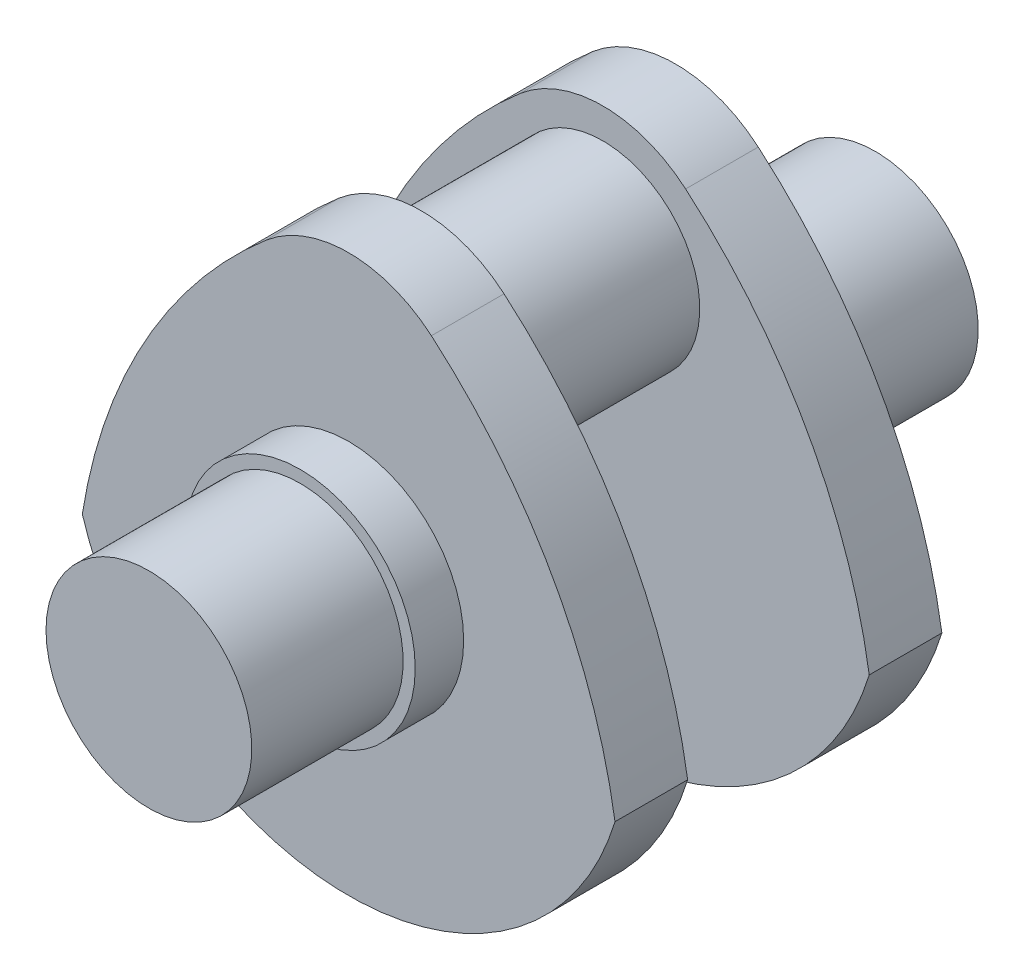
ISO-10303-21;
HEADER;
FILE_DESCRIPTION(('STEP AP214'),'2;1');
FILE_NAME('part.step','',(''),(''),'','','');
FILE_SCHEMA(('AUTOMOTIVE_DESIGN { 1 0 10303 214 1 1 1 1 }'));
ENDSEC;
DATA;
#1=APPLICATION_CONTEXT('core data for automotive mechanical design processes');
#2=APPLICATION_PROTOCOL_DEFINITION('international standard','automotive_design',2000,#1);
#3=PRODUCT_CONTEXT('',#1,'mechanical');
#4=PRODUCT('Part','Part','',(#3));
#5=PRODUCT_RELATED_PRODUCT_CATEGORY('part','',(#4));
#6=PRODUCT_DEFINITION_FORMATION('','',#4);
#7=PRODUCT_DEFINITION_CONTEXT('part definition',#1,'design');
#8=PRODUCT_DEFINITION('design','',#6,#7);
#9=PRODUCT_DEFINITION_SHAPE('','',#8);
#10=(LENGTH_UNIT() NAMED_UNIT(*) SI_UNIT(.MILLI.,.METRE.));
#11=(NAMED_UNIT(*) PLANE_ANGLE_UNIT() SI_UNIT($,.RADIAN.));
#12=(NAMED_UNIT(*) SI_UNIT($,.STERADIAN.) SOLID_ANGLE_UNIT());
#13=UNCERTAINTY_MEASURE_WITH_UNIT(LENGTH_MEASURE(1.E-05),#10,'distance_accuracy_value','');
#14=(GEOMETRIC_REPRESENTATION_CONTEXT(3) GLOBAL_UNCERTAINTY_ASSIGNED_CONTEXT((#13)) GLOBAL_UNIT_ASSIGNED_CONTEXT((#10,
#11,#12)) REPRESENTATION_CONTEXT('',''));
#15=CARTESIAN_POINT('',(0.,0.,0.));
#16=DIRECTION('',(0.,0.,1.));
#17=DIRECTION('',(1.,0.,0.));
#18=AXIS2_PLACEMENT_3D('',#15,#16,#17);
#19=CARTESIAN_POINT('',(0.,0.,635.));
#20=DIRECTION('',(0.,0.,-1.));
#21=DIRECTION('',(-1.,0.,0.));
#22=AXIS2_PLACEMENT_3D('',#19,#20,#21);
#23=CYLINDRICAL_SURFACE('',#22,431.8);
#24=CARTESIAN_POINT('',(0.,0.,635.));
#25=DIRECTION('',(0.,0.,1.));
#26=DIRECTION('',(1.,0.,0.));
#27=AXIS2_PLACEMENT_3D('',#24,#25,#26);
#28=CIRCLE('',#27,431.8);
#29=CARTESIAN_POINT('',(-431.8,0.,635.));
#30=VERTEX_POINT('',#29);
#31=EDGE_CURVE('E11',#30,#30,#28,.T.);
#32=CARTESIAN_POINT('',(0.,0.,0.));
#33=DIRECTION('',(0.,0.,1.));
#34=DIRECTION('',(1.,0.,0.));
#35=AXIS2_PLACEMENT_3D('',#32,#33,#34);
#36=CIRCLE('',#35,431.8);
#37=CARTESIAN_POINT('',(-431.8,0.,-1.11022302462516E-13));
#38=VERTEX_POINT('',#37);
#39=EDGE_CURVE('E39',#38,#38,#36,.T.);
#40=CARTESIAN_POINT('',(-431.8,0.,635.));
#41=CARTESIAN_POINT('',(-431.8,0.,628.385416666667));
#42=CARTESIAN_POINT('',(-431.8,0.,621.770833333333));
#43=CARTESIAN_POINT('',(-431.8,0.,608.541666666667));
#44=CARTESIAN_POINT('',(-431.8,0.,601.927083333333));
#45=CARTESIAN_POINT('',(-431.8,0.,588.697916666667));
#46=CARTESIAN_POINT('',(-431.8,0.,582.083333333333));
#47=CARTESIAN_POINT('',(-431.8,0.,568.854166666667));
#48=CARTESIAN_POINT('',(-431.8,0.,562.239583333333));
#49=CARTESIAN_POINT('',(-431.8,0.,549.010416666667));
#50=CARTESIAN_POINT('',(-431.8,0.,542.395833333333));
#51=CARTESIAN_POINT('',(-431.8,0.,529.166666666667));
#52=CARTESIAN_POINT('',(-431.8,0.,522.552083333333));
#53=CARTESIAN_POINT('',(-431.8,0.,509.322916666667));
#54=CARTESIAN_POINT('',(-431.8,0.,502.708333333333));
#55=CARTESIAN_POINT('',(-431.8,0.,489.479166666667));
#56=CARTESIAN_POINT('',(-431.8,0.,482.864583333333));
#57=CARTESIAN_POINT('',(-431.8,0.,469.635416666667));
#58=CARTESIAN_POINT('',(-431.8,0.,463.020833333333));
#59=CARTESIAN_POINT('',(-431.8,0.,449.791666666667));
#60=CARTESIAN_POINT('',(-431.8,0.,443.177083333333));
#61=CARTESIAN_POINT('',(-431.8,0.,429.947916666667));
#62=CARTESIAN_POINT('',(-431.8,0.,423.333333333333));
#63=CARTESIAN_POINT('',(-431.8,0.,410.104166666667));
#64=CARTESIAN_POINT('',(-431.8,0.,403.489583333333));
#65=CARTESIAN_POINT('',(-431.8,0.,390.260416666667));
#66=CARTESIAN_POINT('',(-431.8,0.,383.645833333333));
#67=CARTESIAN_POINT('',(-431.8,0.,370.416666666667));
#68=CARTESIAN_POINT('',(-431.8,0.,363.802083333333));
#69=CARTESIAN_POINT('',(-431.8,0.,350.572916666667));
#70=CARTESIAN_POINT('',(-431.8,0.,343.958333333333));
#71=CARTESIAN_POINT('',(-431.8,0.,330.729166666667));
#72=CARTESIAN_POINT('',(-431.8,0.,324.114583333333));
#73=CARTESIAN_POINT('',(-431.8,0.,310.885416666667));
#74=CARTESIAN_POINT('',(-431.8,0.,304.270833333333));
#75=CARTESIAN_POINT('',(-431.8,0.,291.041666666667));
#76=CARTESIAN_POINT('',(-431.8,0.,284.427083333333));
#77=CARTESIAN_POINT('',(-431.8,0.,271.197916666667));
#78=CARTESIAN_POINT('',(-431.8,0.,264.583333333333));
#79=CARTESIAN_POINT('',(-431.8,0.,251.354166666667));
#80=CARTESIAN_POINT('',(-431.8,0.,244.739583333333));
#81=CARTESIAN_POINT('',(-431.8,0.,231.510416666667));
#82=CARTESIAN_POINT('',(-431.8,0.,224.895833333333));
#83=CARTESIAN_POINT('',(-431.8,0.,211.666666666667));
#84=CARTESIAN_POINT('',(-431.8,0.,205.052083333333));
#85=CARTESIAN_POINT('',(-431.8,0.,191.822916666666));
#86=CARTESIAN_POINT('',(-431.8,0.,185.208333333333));
#87=CARTESIAN_POINT('',(-431.8,0.,171.979166666666));
#88=CARTESIAN_POINT('',(-431.8,0.,165.364583333333));
#89=CARTESIAN_POINT('',(-431.8,0.,152.135416666666));
#90=CARTESIAN_POINT('',(-431.8,0.,145.520833333333));
#91=CARTESIAN_POINT('',(-431.8,0.,132.291666666667));
#92=CARTESIAN_POINT('',(-431.8,0.,125.677083333333));
#93=CARTESIAN_POINT('',(-431.8,0.,112.447916666667));
#94=CARTESIAN_POINT('',(-431.8,0.,105.833333333333));
#95=CARTESIAN_POINT('',(-431.8,0.,92.6041666666666));
#96=CARTESIAN_POINT('',(-431.8,0.,85.9895833333332));
#97=CARTESIAN_POINT('',(-431.8,0.,72.7604166666665));
#98=CARTESIAN_POINT('',(-431.8,0.,66.1458333333332));
#99=CARTESIAN_POINT('',(-431.8,0.,52.9166666666666));
#100=CARTESIAN_POINT('',(-431.8,0.,46.3020833333332));
#101=CARTESIAN_POINT('',(-431.8,0.,33.0729166666666));
#102=CARTESIAN_POINT('',(-431.8,0.,26.4583333333333));
#103=CARTESIAN_POINT('',(-431.8,0.,13.2291666666666));
#104=CARTESIAN_POINT('',(-431.8,0.,6.61458333333324));
#105=CARTESIAN_POINT('',(-431.8,0.,-1.11022302462516E-13));
#106=B_SPLINE_CURVE_WITH_KNOTS('',3,(#40,#41,#42,#43,#44,#45,#46,#47,#48,#49,#50,#51,#52,#53,
#54,#55,#56,#57,#58,#59,#60,#61,#62,#63,#64,#65,#66,#67,#68,#69,#70,#71,#72,#73,#74,#75,#76,#77,
#78,#79,#80,#81,#82,#83,#84,#85,#86,#87,#88,#89,#90,#91,#92,#93,#94,#95,#96,#97,#98,#99,#100,
#101,#102,#103,#104,#105),.UNSPECIFIED.,.F.,.F.,(4,2,2,2,2,2,2,2,2,2,2,2,2,2,2,2,2,2,2,2,2,2,2,
2,2,2,2,2,2,2,2,2,4),(0.,19.84375,39.6875000000001,59.53125,79.3750000000001,99.2187500000001,
119.0625,138.90625,158.75,178.59375,198.4375,218.28125,238.125,257.96875,277.8125,297.65625,
317.5,337.34375,357.1875,377.03125,396.875,416.71875,436.5625,456.40625,476.25,496.09375,
515.9375,535.78125,555.625,575.46875,595.3125,615.15625,635.),.UNSPECIFIED.);
#107=EDGE_CURVE('BSEAM36',#30,#38,#106,.T.);
#108=ORIENTED_EDGE('',*,*,#31,.F.);
#109=ORIENTED_EDGE('',*,*,#39,.T.);
#110=ORIENTED_EDGE('',*,*,#107,.T.);
#111=ORIENTED_EDGE('',*,*,#107,.F.);
#112=EDGE_LOOP('',(#108,#110,#109,#111));
#113=FACE_BOUND('',#112,.T.);
#114=ADVANCED_FACE('F36',(#113),#23,.T.);
#115=CARTESIAN_POINT('',(0.,0.,635.));
#116=DIRECTION('',(0.,0.,1.));
#117=DIRECTION('',(1.,0.,0.));
#118=AXIS2_PLACEMENT_3D('',#115,#116,#117);
#119=PLANE('',#118);
#120=ORIENTED_EDGE('',*,*,#31,.T.);
#121=EDGE_LOOP('',(#120));
#122=FACE_BOUND('',#121,.T.);
#123=ADVANCED_FACE('F215',(#122),#119,.T.);
#124=CARTESIAN_POINT('',(0.,0.,-203.2));
#125=DIRECTION('',(0.,0.,1.));
#126=DIRECTION('',(1.,0.,0.));
#127=AXIS2_PLACEMENT_3D('',#124,#125,#126);
#128=CYLINDRICAL_SURFACE('',#127,482.6);
#129=CARTESIAN_POINT('',(0.,0.,-203.2));
#130=DIRECTION('',(0.,0.,1.));
#131=DIRECTION('',(1.,0.,0.));
#132=AXIS2_PLACEMENT_3D('',#129,#130,#131);
#133=CIRCLE('',#132,482.6);
#134=CARTESIAN_POINT('',(482.6,0.,-203.2));
#135=VERTEX_POINT('',#134);
#136=EDGE_CURVE('E192',#135,#135,#133,.T.);
#137=ORIENTED_EDGE('',*,*,#136,.T.);
#138=EDGE_LOOP('',(#137));
#139=FACE_BOUND('',#138,.T.);
#140=CARTESIAN_POINT('',(0.,0.,0.));
#141=DIRECTION('',(0.,0.,1.));
#142=DIRECTION('',(1.,0.,0.));
#143=AXIS2_PLACEMENT_3D('',#140,#141,#142);
#144=CIRCLE('',#143,482.6);
#145=CARTESIAN_POINT('',(482.6,0.,0.));
#146=VERTEX_POINT('',#145);
#147=EDGE_CURVE('E195',#146,#146,#144,.T.);
#148=ORIENTED_EDGE('',*,*,#147,.F.);
#149=EDGE_LOOP('',(#148));
#150=FACE_BOUND('',#149,.T.);
#151=ADVANCED_FACE('F206',(#139,#150),#128,.T.);
#152=CARTESIAN_POINT('',(0.,0.,0.));
#153=DIRECTION('',(0.,0.,1.));
#154=DIRECTION('',(1.,0.,0.));
#155=AXIS2_PLACEMENT_3D('',#152,#153,#154);
#156=PLANE('',#155);
#157=ORIENTED_EDGE('',*,*,#39,.F.);
#158=EDGE_LOOP('',(#157));
#159=FACE_BOUND('',#158,.T.);
#160=ORIENTED_EDGE('',*,*,#147,.T.);
#161=EDGE_LOOP('',(#160));
#162=FACE_BOUND('',#161,.T.);
#163=ADVANCED_FACE('F203',(#159,#162),#156,.T.);
#164=CARTESIAN_POINT('',(-1140.70013677076,-695.567532285063,-508.));
#165=DIRECTION('',(0.,0.,1.));
#166=DIRECTION('',(1.,0.,0.));
#167=AXIS2_PLACEMENT_3D('',#164,#165,#166);
#168=CYLINDRICAL_SURFACE('',#167,2286.);
#169=CARTESIAN_POINT('',(-1140.70013677076,-695.567532285063,-203.2));
#170=DIRECTION('',(0.,0.,-1.));
#171=DIRECTION('',(-1.,0.,0.));
#172=AXIS2_PLACEMENT_3D('',#169,#170,#171);
#173=CIRCLE('',#172,2286.);
#174=CARTESIAN_POINT('',(347.169606843276,1039.95533591285,-203.2));
#175=VERTEX_POINT('',#174);
#176=CARTESIAN_POINT('',(1117.6,-340.776759770967,-203.2));
#177=VERTEX_POINT('',#176);
#178=EDGE_CURVE('E171',#175,#177,#173,.T.);
#179=ORIENTED_EDGE('',*,*,#178,.T.);
#180=DIRECTION('',(0.,0.,1.));
#181=VECTOR('',#180,1.);
#182=CARTESIAN_POINT('',(1117.6,-340.776759770967,-508.));
#183=LINE('',#182,#181);
#184=CARTESIAN_POINT('',(1117.6,-340.776759770967,-508.));
#185=VERTEX_POINT('',#184);
#186=EDGE_CURVE('E190',#185,#177,#183,.T.);
#187=ORIENTED_EDGE('',*,*,#186,.F.);
#188=CARTESIAN_POINT('',(-1140.70013677076,-695.567532285063,-508.));
#189=DIRECTION('',(0.,0.,-1.));
#190=DIRECTION('',(-1.,0.,0.));
#191=AXIS2_PLACEMENT_3D('',#188,#189,#190);
#192=CIRCLE('',#191,2286.);
#193=CARTESIAN_POINT('',(347.169606843276,1039.95533591285,-508.));
#194=VERTEX_POINT('',#193);
#195=EDGE_CURVE('E172',#194,#185,#192,.T.);
#196=ORIENTED_EDGE('',*,*,#195,.F.);
#197=DIRECTION('',(0.,0.,1.));
#198=VECTOR('',#197,1.);
#199=CARTESIAN_POINT('',(347.169606843276,1039.95533591285,-508.));
#200=LINE('',#199,#198);
#201=EDGE_CURVE('E178',#194,#175,#200,.T.);
#202=ORIENTED_EDGE('',*,*,#201,.T.);
#203=EDGE_LOOP('',(#179,#187,#196,#202));
#204=FACE_BOUND('',#203,.T.);
#205=ADVANCED_FACE('F205',(#204),#168,.T.);
#206=CARTESIAN_POINT('',(0.,0.,-508.));
#207=DIRECTION('',(0.,0.,1.));
#208=DIRECTION('',(1.,0.,0.));
#209=AXIS2_PLACEMENT_3D('',#206,#207,#208);
#210=CYLINDRICAL_SURFACE('',#209,1168.4);
#211=CARTESIAN_POINT('',(0.,0.,-203.2));
#212=DIRECTION('',(0.,0.,-1.));
#213=DIRECTION('',(-1.,0.,0.));
#214=AXIS2_PLACEMENT_3D('',#211,#212,#213);
#215=CIRCLE('',#214,1168.4);
#216=CARTESIAN_POINT('',(-1117.6,-340.776759770968,-203.2));
#217=VERTEX_POINT('',#216);
#218=EDGE_CURVE('E181',#177,#217,#215,.T.);
#219=ORIENTED_EDGE('',*,*,#218,.T.);
#220=DIRECTION('',(0.,0.,1.));
#221=VECTOR('',#220,1.);
#222=CARTESIAN_POINT('',(-1117.6,-340.776759770968,-508.));
#223=LINE('',#222,#221);
#224=CARTESIAN_POINT('',(-1117.6,-340.776759770968,-508.));
#225=VERTEX_POINT('',#224);
#226=EDGE_CURVE('E188',#225,#217,#223,.T.);
#227=ORIENTED_EDGE('',*,*,#226,.F.);
#228=CARTESIAN_POINT('',(0.,0.,-508.));
#229=DIRECTION('',(0.,0.,-1.));
#230=DIRECTION('',(-1.,0.,0.));
#231=AXIS2_PLACEMENT_3D('',#228,#229,#230);
#232=CIRCLE('',#231,1168.4);
#233=EDGE_CURVE('E84',#185,#225,#232,.T.);
#234=ORIENTED_EDGE('',*,*,#233,.F.);
#235=ORIENTED_EDGE('',*,*,#186,.T.);
#236=EDGE_LOOP('',(#219,#227,#234,#235));
#237=FACE_BOUND('',#236,.T.);
#238=ADVANCED_FACE('F212',(#237),#210,.T.);
#239=CARTESIAN_POINT('',(1140.70013677076,-695.567532285061,-508.));
#240=DIRECTION('',(0.,0.,1.));
#241=DIRECTION('',(1.,0.,0.));
#242=AXIS2_PLACEMENT_3D('',#239,#240,#241);
#243=CYLINDRICAL_SURFACE('',#242,2286.);
#244=CARTESIAN_POINT('',(1140.70013677076,-695.567532285061,-203.2));
#245=DIRECTION('',(0.,0.,-1.));
#246=DIRECTION('',(1.,0.,0.));
#247=AXIS2_PLACEMENT_3D('',#244,#245,#246);
#248=CIRCLE('',#247,2286.);
#249=CARTESIAN_POINT('',(-347.169606843277,1039.95533591285,-203.2));
#250=VERTEX_POINT('',#249);
#251=EDGE_CURVE('E70',#217,#250,#248,.T.);
#252=ORIENTED_EDGE('',*,*,#251,.T.);
#253=DIRECTION('',(0.,0.,1.));
#254=VECTOR('',#253,1.);
#255=CARTESIAN_POINT('',(-347.169606843277,1039.95533591285,-508.));
#256=LINE('',#255,#254);
#257=CARTESIAN_POINT('',(-347.169606843277,1039.95533591285,-508.));
#258=VERTEX_POINT('',#257);
#259=EDGE_CURVE('E186',#258,#250,#256,.T.);
#260=ORIENTED_EDGE('',*,*,#259,.F.);
#261=CARTESIAN_POINT('',(1140.70013677076,-695.567532285061,-508.));
#262=DIRECTION('',(0.,0.,-1.));
#263=DIRECTION('',(1.,0.,0.));
#264=AXIS2_PLACEMENT_3D('',#261,#262,#263);
#265=CIRCLE('',#264,2286.);
#266=EDGE_CURVE('E175',#225,#258,#265,.T.);
#267=ORIENTED_EDGE('',*,*,#266,.F.);
#268=ORIENTED_EDGE('',*,*,#226,.T.);
#269=EDGE_LOOP('',(#252,#260,#267,#268));
#270=FACE_BOUND('',#269,.T.);
#271=ADVANCED_FACE('F250',(#270),#243,.T.);
#272=CARTESIAN_POINT('',(0.,635.,-508.));
#273=DIRECTION('',(0.,0.,1.));
#274=DIRECTION('',(1.,0.,0.));
#275=AXIS2_PLACEMENT_3D('',#272,#273,#274);
#276=CYLINDRICAL_SURFACE('',#275,533.4);
#277=CARTESIAN_POINT('',(0.,635.,-203.2));
#278=DIRECTION('',(0.,0.,-1.));
#279=DIRECTION('',(-1.,0.,0.));
#280=AXIS2_PLACEMENT_3D('',#277,#278,#279);
#281=CIRCLE('',#280,533.4);
#282=EDGE_CURVE('E76',#250,#175,#281,.T.);
#283=ORIENTED_EDGE('',*,*,#282,.T.);
#284=ORIENTED_EDGE('',*,*,#201,.F.);
#285=CARTESIAN_POINT('',(0.,635.,-508.));
#286=DIRECTION('',(0.,0.,-1.));
#287=DIRECTION('',(-1.,0.,0.));
#288=AXIS2_PLACEMENT_3D('',#285,#286,#287);
#289=CIRCLE('',#288,533.4);
#290=EDGE_CURVE('E52',#258,#194,#289,.T.);
#291=ORIENTED_EDGE('',*,*,#290,.F.);
#292=ORIENTED_EDGE('',*,*,#259,.T.);
#293=EDGE_LOOP('',(#283,#284,#291,#292));
#294=FACE_BOUND('',#293,.T.);
#295=ADVANCED_FACE('F258',(#294),#276,.T.);
#296=CARTESIAN_POINT('',(-570.350068385382,-347.783766142531,-508.));
#297=DIRECTION('',(0.,0.,-1.));
#298=DIRECTION('',(-1.,0.,0.));
#299=AXIS2_PLACEMENT_3D('',#296,#297,#298);
#300=PLANE('',#299);
#301=CARTESIAN_POINT('',(0.,635.,-508.));
#302=DIRECTION('',(0.,0.,-1.));
#303=DIRECTION('',(-1.,0.,0.));
#304=AXIS2_PLACEMENT_3D('',#301,#302,#303);
#305=CIRCLE('',#304,406.4);
#306=CARTESIAN_POINT('',(-406.4,635.,-508.));
#307=VERTEX_POINT('',#306);
#308=EDGE_CURVE('E166',#307,#307,#305,.T.);
#309=ORIENTED_EDGE('',*,*,#308,.F.);
#310=EDGE_LOOP('',(#309));
#311=FACE_BOUND('',#310,.T.);
#312=ORIENTED_EDGE('',*,*,#195,.T.);
#313=ORIENTED_EDGE('',*,*,#233,.T.);
#314=ORIENTED_EDGE('',*,*,#266,.T.);
#315=ORIENTED_EDGE('',*,*,#290,.T.);
#316=EDGE_LOOP('',(#312,#313,#314,#315));
#317=FACE_BOUND('',#316,.T.);
#318=ADVANCED_FACE('F266',(#311,#317),#300,.T.);
#319=CARTESIAN_POINT('',(-570.350068385382,-347.783766142531,-203.2));
#320=DIRECTION('',(0.,0.,-1.));
#321=DIRECTION('',(-1.,0.,0.));
#322=AXIS2_PLACEMENT_3D('',#319,#320,#321);
#323=PLANE('',#322);
#324=ORIENTED_EDGE('',*,*,#136,.F.);
#325=EDGE_LOOP('',(#324));
#326=FACE_BOUND('',#325,.T.);
#327=ORIENTED_EDGE('',*,*,#178,.F.);
#328=ORIENTED_EDGE('',*,*,#282,.F.);
#329=ORIENTED_EDGE('',*,*,#251,.F.);
#330=ORIENTED_EDGE('',*,*,#218,.F.);
#331=EDGE_LOOP('',(#327,#328,#329,#330));
#332=FACE_BOUND('',#331,.T.);
#333=ADVANCED_FACE('F271',(#326,#332),#323,.F.);
#334=CARTESIAN_POINT('',(0.,635.,-889.));
#335=DIRECTION('',(0.,0.,1.));
#336=DIRECTION('',(1.,0.,0.));
#337=AXIS2_PLACEMENT_3D('',#334,#335,#336);
#338=CYLINDRICAL_SURFACE('',#337,406.4);
#339=ORIENTED_EDGE('',*,*,#308,.T.);
#340=EDGE_LOOP('',(#339));
#341=FACE_BOUND('',#340,.T.);
#342=CARTESIAN_POINT('',(0.,635.,-1270.));
#343=DIRECTION('',(0.,0.,-1.));
#344=DIRECTION('',(-1.,0.,0.));
#345=AXIS2_PLACEMENT_3D('',#342,#343,#344);
#346=CIRCLE('',#345,406.4);
#347=CARTESIAN_POINT('',(-406.4,635.,-1270.));
#348=VERTEX_POINT('',#347);
#349=EDGE_CURVE('E142',#348,#348,#346,.T.);
#350=ORIENTED_EDGE('',*,*,#349,.F.);
#351=EDGE_LOOP('',(#350));
#352=FACE_BOUND('',#351,.T.);
#353=ADVANCED_FACE('F275',(#341,#352),#338,.T.);
#354=CARTESIAN_POINT('',(0.,0.,-2413.));
#355=DIRECTION('',(0.,0.,1.));
#356=DIRECTION('',(-1.,0.,0.));
#357=AXIS2_PLACEMENT_3D('',#354,#355,#356);
#358=CYLINDRICAL_SURFACE('',#357,431.8);
#359=CARTESIAN_POINT('',(0.,0.,-2413.));
#360=DIRECTION('',(0.,0.,1.));
#361=DIRECTION('',(1.,0.,0.));
#362=AXIS2_PLACEMENT_3D('',#359,#360,#361);
#363=CIRCLE('',#362,431.8);
#364=CARTESIAN_POINT('',(-431.8,0.,-2413.));
#365=VERTEX_POINT('',#364);
#366=EDGE_CURVE('E163',#365,#365,#363,.T.);
#367=CARTESIAN_POINT('',(0.,0.,-1778.));
#368=DIRECTION('',(0.,0.,1.));
#369=DIRECTION('',(1.,0.,0.));
#370=AXIS2_PLACEMENT_3D('',#367,#368,#369);
#371=CIRCLE('',#370,431.8);
#372=CARTESIAN_POINT('',(-431.8,0.,-1778.));
#373=VERTEX_POINT('',#372);
#374=EDGE_CURVE('E162',#373,#373,#371,.T.);
#375=CARTESIAN_POINT('',(-431.8,0.,-2413.));
#376=CARTESIAN_POINT('',(-431.8,0.,-2406.38541666667));
#377=CARTESIAN_POINT('',(-431.8,0.,-2399.77083333333));
#378=CARTESIAN_POINT('',(-431.8,0.,-2386.54166666667));
#379=CARTESIAN_POINT('',(-431.8,0.,-2379.92708333333));
#380=CARTESIAN_POINT('',(-431.8,0.,-2366.69791666667));
#381=CARTESIAN_POINT('',(-431.8,0.,-2360.08333333333));
#382=CARTESIAN_POINT('',(-431.8,0.,-2346.85416666667));
#383=CARTESIAN_POINT('',(-431.8,0.,-2340.23958333333));
#384=CARTESIAN_POINT('',(-431.8,0.,-2327.01041666667));
#385=CARTESIAN_POINT('',(-431.8,0.,-2320.39583333333));
#386=CARTESIAN_POINT('',(-431.8,0.,-2307.16666666667));
#387=CARTESIAN_POINT('',(-431.8,0.,-2300.55208333333));
#388=CARTESIAN_POINT('',(-431.8,0.,-2287.32291666667));
#389=CARTESIAN_POINT('',(-431.8,0.,-2280.70833333333));
#390=CARTESIAN_POINT('',(-431.8,0.,-2267.47916666667));
#391=CARTESIAN_POINT('',(-431.8,0.,-2260.86458333333));
#392=CARTESIAN_POINT('',(-431.8,0.,-2247.63541666667));
#393=CARTESIAN_POINT('',(-431.8,0.,-2241.02083333333));
#394=CARTESIAN_POINT('',(-431.8,0.,-2227.79166666667));
#395=CARTESIAN_POINT('',(-431.8,0.,-2221.17708333333));
#396=CARTESIAN_POINT('',(-431.8,0.,-2207.94791666667));
#397=CARTESIAN_POINT('',(-431.8,0.,-2201.33333333333));
#398=CARTESIAN_POINT('',(-431.8,0.,-2188.10416666667));
#399=CARTESIAN_POINT('',(-431.8,0.,-2181.48958333333));
#400=CARTESIAN_POINT('',(-431.8,0.,-2168.26041666667));
#401=CARTESIAN_POINT('',(-431.8,0.,-2161.64583333333));
#402=CARTESIAN_POINT('',(-431.8,0.,-2148.41666666667));
#403=CARTESIAN_POINT('',(-431.8,0.,-2141.80208333333));
#404=CARTESIAN_POINT('',(-431.8,0.,-2128.57291666667));
#405=CARTESIAN_POINT('',(-431.8,0.,-2121.95833333333));
#406=CARTESIAN_POINT('',(-431.8,0.,-2108.72916666667));
#407=CARTESIAN_POINT('',(-431.8,0.,-2102.11458333333));
#408=CARTESIAN_POINT('',(-431.8,0.,-2088.88541666667));
#409=CARTESIAN_POINT('',(-431.8,0.,-2082.27083333333));
#410=CARTESIAN_POINT('',(-431.8,0.,-2069.04166666667));
#411=CARTESIAN_POINT('',(-431.8,0.,-2062.42708333333));
#412=CARTESIAN_POINT('',(-431.8,0.,-2049.19791666667));
#413=CARTESIAN_POINT('',(-431.8,0.,-2042.58333333333));
#414=CARTESIAN_POINT('',(-431.8,0.,-2029.35416666667));
#415=CARTESIAN_POINT('',(-431.8,0.,-2022.73958333333));
#416=CARTESIAN_POINT('',(-431.8,0.,-2009.51041666667));
#417=CARTESIAN_POINT('',(-431.8,0.,-2002.89583333333));
#418=CARTESIAN_POINT('',(-431.8,0.,-1989.66666666667));
#419=CARTESIAN_POINT('',(-431.8,0.,-1983.05208333333));
#420=CARTESIAN_POINT('',(-431.8,0.,-1969.82291666667));
#421=CARTESIAN_POINT('',(-431.8,0.,-1963.20833333333));
#422=CARTESIAN_POINT('',(-431.8,0.,-1949.97916666667));
#423=CARTESIAN_POINT('',(-431.8,0.,-1943.36458333333));
#424=CARTESIAN_POINT('',(-431.8,0.,-1930.13541666667));
#425=CARTESIAN_POINT('',(-431.8,0.,-1923.52083333333));
#426=CARTESIAN_POINT('',(-431.8,0.,-1910.29166666667));
#427=CARTESIAN_POINT('',(-431.8,0.,-1903.67708333333));
#428=CARTESIAN_POINT('',(-431.8,0.,-1890.44791666667));
#429=CARTESIAN_POINT('',(-431.8,0.,-1883.83333333333));
#430=CARTESIAN_POINT('',(-431.8,0.,-1870.60416666667));
#431=CARTESIAN_POINT('',(-431.8,0.,-1863.98958333333));
#432=CARTESIAN_POINT('',(-431.8,0.,-1850.76041666667));
#433=CARTESIAN_POINT('',(-431.8,0.,-1844.14583333333));
#434=CARTESIAN_POINT('',(-431.8,0.,-1830.91666666667));
#435=CARTESIAN_POINT('',(-431.8,0.,-1824.30208333333));
#436=CARTESIAN_POINT('',(-431.8,0.,-1811.07291666667));
#437=CARTESIAN_POINT('',(-431.8,0.,-1804.45833333333));
#438=CARTESIAN_POINT('',(-431.8,0.,-1791.22916666667));
#439=CARTESIAN_POINT('',(-431.8,0.,-1784.61458333333));
#440=CARTESIAN_POINT('',(-431.8,0.,-1778.));
#441=B_SPLINE_CURVE_WITH_KNOTS('',3,(#375,#376,#377,#378,#379,#380,#381,#382,#383,#384,#385,
#386,#387,#388,#389,#390,#391,#392,#393,#394,#395,#396,#397,#398,#399,#400,#401,#402,#403,#404,
#405,#406,#407,#408,#409,#410,#411,#412,#413,#414,#415,#416,#417,#418,#419,#420,#421,#422,#423,
#424,#425,#426,#427,#428,#429,#430,#431,#432,#433,#434,#435,#436,#437,#438,#439,#440),
.UNSPECIFIED.,.F.,.F.,(4,2,2,2,2,2,2,2,2,2,2,2,2,2,2,2,2,2,2,2,2,2,2,2,2,2,2,2,2,2,2,2,4),(0.,
19.8437499999997,39.6874999999999,59.53125,79.3749999999997,99.2187499999999,119.0625,138.90625,
158.75,178.59375,198.4375,218.28125,238.125,257.96875,277.8125,297.65625,317.5,337.34375,
357.1875,377.03125,396.875,416.71875,436.5625,456.40625,476.25,496.09375,515.9375,535.78125,
555.625,575.46875,595.3125,615.15625,635.),.UNSPECIFIED.);
#442=EDGE_CURVE('BSEAM293',#365,#373,#441,.T.);
#443=ORIENTED_EDGE('',*,*,#366,.T.);
#444=ORIENTED_EDGE('',*,*,#374,.F.);
#445=ORIENTED_EDGE('',*,*,#442,.T.);
#446=ORIENTED_EDGE('',*,*,#442,.F.);
#447=EDGE_LOOP('',(#443,#445,#444,#446));
#448=FACE_BOUND('',#447,.T.);
#449=ADVANCED_FACE('F293',(#448),#358,.T.);
#450=CARTESIAN_POINT('',(0.,0.,-2413.));
#451=DIRECTION('',(0.,0.,-1.));
#452=DIRECTION('',(1.,0.,0.));
#453=AXIS2_PLACEMENT_3D('',#450,#451,#452);
#454=PLANE('',#453);
#455=ORIENTED_EDGE('',*,*,#366,.F.);
#456=EDGE_LOOP('',(#455));
#457=FACE_BOUND('',#456,.T.);
#458=ADVANCED_FACE('F303',(#457),#454,.T.);
#459=CARTESIAN_POINT('',(0.,0.,-1574.8));
#460=DIRECTION('',(0.,0.,-1.));
#461=DIRECTION('',(1.,0.,0.));
#462=AXIS2_PLACEMENT_3D('',#459,#460,#461);
#463=CYLINDRICAL_SURFACE('',#462,482.6);
#464=CARTESIAN_POINT('',(0.,0.,-1574.8));
#465=DIRECTION('',(0.,0.,1.));
#466=DIRECTION('',(1.,0.,0.));
#467=AXIS2_PLACEMENT_3D('',#464,#465,#466);
#468=CIRCLE('',#467,482.6);
#469=CARTESIAN_POINT('',(482.6,0.,-1574.8));
#470=VERTEX_POINT('',#469);
#471=EDGE_CURVE('E131',#470,#470,#468,.T.);
#472=ORIENTED_EDGE('',*,*,#471,.F.);
#473=EDGE_LOOP('',(#472));
#474=FACE_BOUND('',#473,.T.);
#475=CARTESIAN_POINT('',(0.,0.,-1778.));
#476=DIRECTION('',(0.,0.,1.));
#477=DIRECTION('',(1.,0.,0.));
#478=AXIS2_PLACEMENT_3D('',#475,#476,#477);
#479=CIRCLE('',#478,482.6);
#480=CARTESIAN_POINT('',(482.6,0.,-1778.));
#481=VERTEX_POINT('',#480);
#482=EDGE_CURVE('E159',#481,#481,#479,.T.);
#483=ORIENTED_EDGE('',*,*,#482,.T.);
#484=EDGE_LOOP('',(#483));
#485=FACE_BOUND('',#484,.T.);
#486=ADVANCED_FACE('F313',(#474,#485),#463,.T.);
#487=CARTESIAN_POINT('',(0.,0.,-1778.));
#488=DIRECTION('',(0.,0.,-1.));
#489=DIRECTION('',(1.,0.,0.));
#490=AXIS2_PLACEMENT_3D('',#487,#488,#489);
#491=PLANE('',#490);
#492=ORIENTED_EDGE('',*,*,#374,.T.);
#493=EDGE_LOOP('',(#492));
#494=FACE_BOUND('',#493,.T.);
#495=ORIENTED_EDGE('',*,*,#482,.F.);
#496=EDGE_LOOP('',(#495));
#497=FACE_BOUND('',#496,.T.);
#498=ADVANCED_FACE('F323',(#494,#497),#491,.T.);
#499=CARTESIAN_POINT('',(-1140.70013677076,-695.567532285063,-1270.));
#500=DIRECTION('',(0.,0.,-1.));
#501=DIRECTION('',(1.,0.,0.));
#502=AXIS2_PLACEMENT_3D('',#499,#500,#501);
#503=CYLINDRICAL_SURFACE('',#502,2286.);
#504=CARTESIAN_POINT('',(-1140.70013677076,-695.567532285063,-1574.8));
#505=DIRECTION('',(0.,0.,-1.));
#506=DIRECTION('',(-1.,0.,0.));
#507=AXIS2_PLACEMENT_3D('',#504,#505,#506);
#508=CIRCLE('',#507,2286.);
#509=CARTESIAN_POINT('',(347.169606843276,1039.95533591285,-1574.8));
#510=VERTEX_POINT('',#509);
#511=CARTESIAN_POINT('',(1117.6,-340.776759770967,-1574.8));
#512=VERTEX_POINT('',#511);
#513=EDGE_CURVE('E147',#510,#512,#508,.T.);
#514=ORIENTED_EDGE('',*,*,#513,.F.);
#515=DIRECTION('',(0.,0.,-1.));
#516=VECTOR('',#515,1.);
#517=CARTESIAN_POINT('',(347.169606843276,1039.95533591285,-1270.));
#518=LINE('',#517,#516);
#519=CARTESIAN_POINT('',(347.169606843276,1039.95533591285,-1270.));
#520=VERTEX_POINT('',#519);
#521=EDGE_CURVE('E136',#520,#510,#518,.T.);
#522=ORIENTED_EDGE('',*,*,#521,.F.);
#523=CARTESIAN_POINT('',(-1140.70013677076,-695.567532285063,-1270.));
#524=DIRECTION('',(0.,0.,-1.));
#525=DIRECTION('',(-1.,0.,0.));
#526=AXIS2_PLACEMENT_3D('',#523,#524,#525);
#527=CIRCLE('',#526,2286.);
#528=CARTESIAN_POINT('',(1117.6,-340.776759770967,-1270.));
#529=VERTEX_POINT('',#528);
#530=EDGE_CURVE('E115',#520,#529,#527,.T.);
#531=ORIENTED_EDGE('',*,*,#530,.T.);
#532=DIRECTION('',(0.,0.,-1.));
#533=VECTOR('',#532,1.);
#534=CARTESIAN_POINT('',(1117.6,-340.776759770967,-1270.));
#535=LINE('',#534,#533);
#536=EDGE_CURVE('E124',#529,#512,#535,.T.);
#537=ORIENTED_EDGE('',*,*,#536,.T.);
#538=EDGE_LOOP('',(#514,#522,#531,#537));
#539=FACE_BOUND('',#538,.T.);
#540=ADVANCED_FACE('F134',(#539),#503,.T.);
#541=CARTESIAN_POINT('',(0.,0.,-1270.));
#542=DIRECTION('',(0.,0.,-1.));
#543=DIRECTION('',(1.,0.,0.));
#544=AXIS2_PLACEMENT_3D('',#541,#542,#543);
#545=CYLINDRICAL_SURFACE('',#544,1168.4);
#546=CARTESIAN_POINT('',(0.,0.,-1574.8));
#547=DIRECTION('',(0.,0.,-1.));
#548=DIRECTION('',(-1.,0.,0.));
#549=AXIS2_PLACEMENT_3D('',#546,#547,#548);
#550=CIRCLE('',#549,1168.4);
#551=CARTESIAN_POINT('',(-1117.6,-340.776759770968,-1574.8));
#552=VERTEX_POINT('',#551);
#553=EDGE_CURVE('E127',#512,#552,#550,.T.);
#554=ORIENTED_EDGE('',*,*,#553,.F.);
#555=ORIENTED_EDGE('',*,*,#536,.F.);
#556=CARTESIAN_POINT('',(0.,0.,-1270.));
#557=DIRECTION('',(0.,0.,-1.));
#558=DIRECTION('',(-1.,0.,0.));
#559=AXIS2_PLACEMENT_3D('',#556,#557,#558);
#560=CIRCLE('',#559,1168.4);
#561=CARTESIAN_POINT('',(-1117.6,-340.776759770968,-1270.));
#562=VERTEX_POINT('',#561);
#563=EDGE_CURVE('E111',#529,#562,#560,.T.);
#564=ORIENTED_EDGE('',*,*,#563,.T.);
#565=DIRECTION('',(0.,0.,-1.));
#566=VECTOR('',#565,1.);
#567=CARTESIAN_POINT('',(-1117.6,-340.776759770968,-1270.));
#568=LINE('',#567,#566);
#569=EDGE_CURVE('E132',#562,#552,#568,.T.);
#570=ORIENTED_EDGE('',*,*,#569,.T.);
#571=EDGE_LOOP('',(#554,#555,#564,#570));
#572=FACE_BOUND('',#571,.T.);
#573=ADVANCED_FACE('F125',(#572),#545,.T.);
#574=CARTESIAN_POINT('',(1140.70013677076,-695.567532285061,-1270.));
#575=DIRECTION('',(0.,0.,-1.));
#576=DIRECTION('',(1.,0.,0.));
#577=AXIS2_PLACEMENT_3D('',#574,#575,#576);
#578=CYLINDRICAL_SURFACE('',#577,2286.);
#579=CARTESIAN_POINT('',(1140.70013677076,-695.567532285061,-1574.8));
#580=DIRECTION('',(0.,0.,-1.));
#581=DIRECTION('',(1.,0.,0.));
#582=AXIS2_PLACEMENT_3D('',#579,#580,#581);
#583=CIRCLE('',#582,2286.);
#584=CARTESIAN_POINT('',(-347.169606843277,1039.95533591285,-1574.8));
#585=VERTEX_POINT('',#584);
#586=EDGE_CURVE('E139',#552,#585,#583,.T.);
#587=ORIENTED_EDGE('',*,*,#586,.F.);
#588=ORIENTED_EDGE('',*,*,#569,.F.);
#589=CARTESIAN_POINT('',(1140.70013677076,-695.567532285061,-1270.));
#590=DIRECTION('',(0.,0.,-1.));
#591=DIRECTION('',(1.,0.,0.));
#592=AXIS2_PLACEMENT_3D('',#589,#590,#591);
#593=CIRCLE('',#592,2286.);
#594=CARTESIAN_POINT('',(-347.169606843277,1039.95533591285,-1270.));
#595=VERTEX_POINT('',#594);
#596=EDGE_CURVE('E118',#562,#595,#593,.T.);
#597=ORIENTED_EDGE('',*,*,#596,.T.);
#598=DIRECTION('',(0.,0.,-1.));
#599=VECTOR('',#598,1.);
#600=CARTESIAN_POINT('',(-347.169606843277,1039.95533591285,-1270.));
#601=LINE('',#600,#599);
#602=EDGE_CURVE('E153',#595,#585,#601,.T.);
#603=ORIENTED_EDGE('',*,*,#602,.T.);
#604=EDGE_LOOP('',(#587,#588,#597,#603));
#605=FACE_BOUND('',#604,.T.);
#606=ADVANCED_FACE('F350',(#605),#578,.T.);
#607=CARTESIAN_POINT('',(0.,635.,-1270.));
#608=DIRECTION('',(0.,0.,-1.));
#609=DIRECTION('',(1.,0.,0.));
#610=AXIS2_PLACEMENT_3D('',#607,#608,#609);
#611=CYLINDRICAL_SURFACE('',#610,533.4);
#612=CARTESIAN_POINT('',(0.,635.,-1574.8));
#613=DIRECTION('',(0.,0.,-1.));
#614=DIRECTION('',(-1.,0.,0.));
#615=AXIS2_PLACEMENT_3D('',#612,#613,#614);
#616=CIRCLE('',#615,533.4);
#617=EDGE_CURVE('E137',#585,#510,#616,.T.);
#618=ORIENTED_EDGE('',*,*,#617,.F.);
#619=ORIENTED_EDGE('',*,*,#602,.F.);
#620=CARTESIAN_POINT('',(0.,635.,-1270.));
#621=DIRECTION('',(0.,0.,-1.));
#622=DIRECTION('',(-1.,0.,0.));
#623=AXIS2_PLACEMENT_3D('',#620,#621,#622);
#624=CIRCLE('',#623,533.4);
#625=EDGE_CURVE('E145',#595,#520,#624,.T.);
#626=ORIENTED_EDGE('',*,*,#625,.T.);
#627=ORIENTED_EDGE('',*,*,#521,.T.);
#628=EDGE_LOOP('',(#618,#619,#626,#627));
#629=FACE_BOUND('',#628,.T.);
#630=ADVANCED_FACE('F359',(#629),#611,.T.);
#631=CARTESIAN_POINT('',(-570.350068385382,-347.783766142531,-1270.));
#632=DIRECTION('',(0.,0.,1.));
#633=DIRECTION('',(-1.,0.,0.));
#634=AXIS2_PLACEMENT_3D('',#631,#632,#633);
#635=PLANE('',#634);
#636=ORIENTED_EDGE('',*,*,#349,.T.);
#637=EDGE_LOOP('',(#636));
#638=FACE_BOUND('',#637,.T.);
#639=ORIENTED_EDGE('',*,*,#530,.F.);
#640=ORIENTED_EDGE('',*,*,#625,.F.);
#641=ORIENTED_EDGE('',*,*,#596,.F.);
#642=ORIENTED_EDGE('',*,*,#563,.F.);
#643=EDGE_LOOP('',(#639,#640,#641,#642));
#644=FACE_BOUND('',#643,.T.);
#645=ADVANCED_FACE('F113',(#638,#644),#635,.T.);
#646=CARTESIAN_POINT('',(-570.350068385382,-347.783766142531,-1574.8));
#647=DIRECTION('',(0.,0.,1.));
#648=DIRECTION('',(-1.,0.,0.));
#649=AXIS2_PLACEMENT_3D('',#646,#647,#648);
#650=PLANE('',#649);
#651=ORIENTED_EDGE('',*,*,#471,.T.);
#652=EDGE_LOOP('',(#651));
#653=FACE_BOUND('',#652,.T.);
#654=ORIENTED_EDGE('',*,*,#513,.T.);
#655=ORIENTED_EDGE('',*,*,#553,.T.);
#656=ORIENTED_EDGE('',*,*,#586,.T.);
#657=ORIENTED_EDGE('',*,*,#617,.T.);
#658=EDGE_LOOP('',(#654,#655,#656,#657));
#659=FACE_BOUND('',#658,.T.);
#660=ADVANCED_FACE('F378',(#653,#659),#650,.F.);
#661=CLOSED_SHELL('',(#114,#123,#151,#163,#205,#238,#271,#295,#318,#333,#353,#449,#458,#486,
#498,#540,#573,#606,#630,#645,#660));
#662=MANIFOLD_SOLID_BREP('B2',#661);
#663=ADVANCED_BREP_SHAPE_REPRESENTATION('',(#18,#662),#14);
#664=SHAPE_DEFINITION_REPRESENTATION(#9,#663);
ENDSEC;
END-ISO-10303-21;
